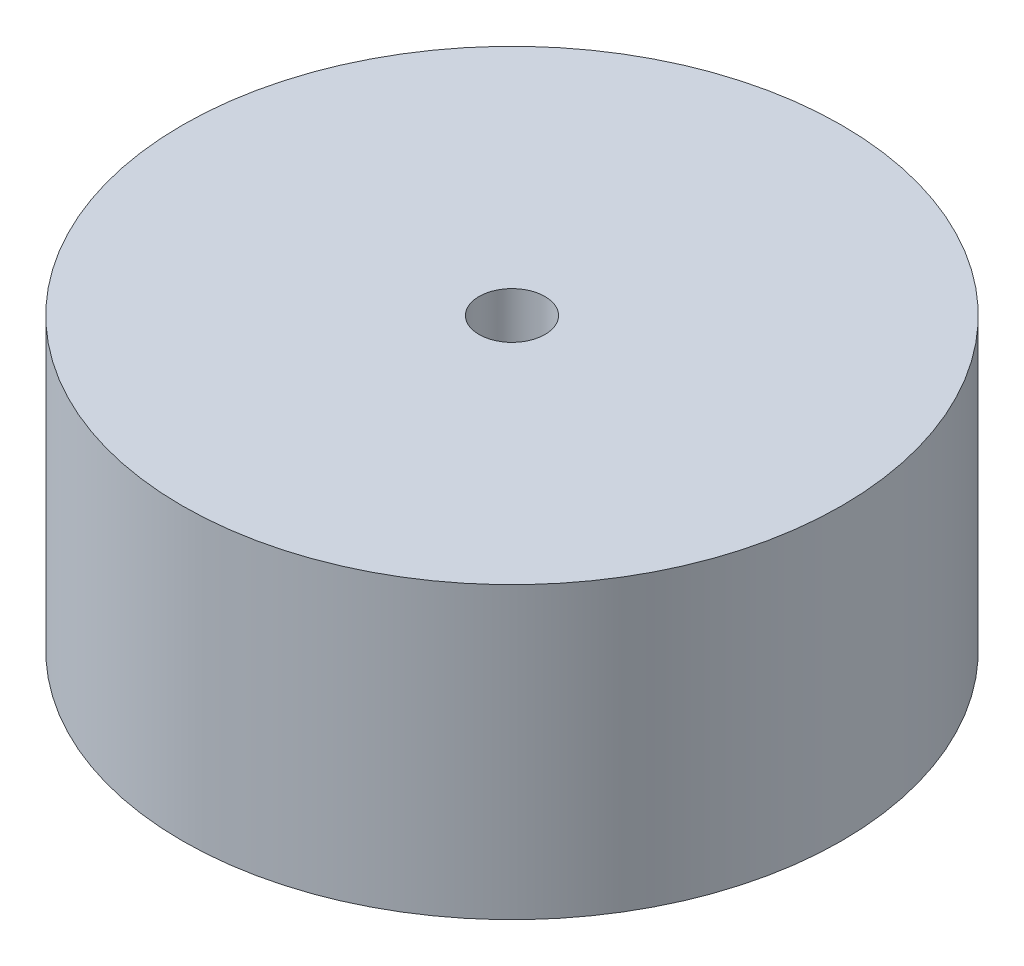
ISO-10303-21;
HEADER;
FILE_DESCRIPTION(('STEP AP214'),'2;1');
FILE_NAME('part.step','',(''),(''),'','','');
FILE_SCHEMA(('AUTOMOTIVE_DESIGN { 1 0 10303 214 1 1 1 1 }'));
ENDSEC;
DATA;
#1=APPLICATION_CONTEXT('core data for automotive mechanical design processes');
#2=APPLICATION_PROTOCOL_DEFINITION('international standard','automotive_design',2000,#1);
#3=PRODUCT_CONTEXT('',#1,'mechanical');
#4=PRODUCT('Part','Part','',(#3));
#5=PRODUCT_RELATED_PRODUCT_CATEGORY('part','',(#4));
#6=PRODUCT_DEFINITION_FORMATION('','',#4);
#7=PRODUCT_DEFINITION_CONTEXT('part definition',#1,'design');
#8=PRODUCT_DEFINITION('design','',#6,#7);
#9=PRODUCT_DEFINITION_SHAPE('','',#8);
#10=(LENGTH_UNIT() NAMED_UNIT(*) SI_UNIT(.MILLI.,.METRE.));
#11=(NAMED_UNIT(*) PLANE_ANGLE_UNIT() SI_UNIT($,.RADIAN.));
#12=(NAMED_UNIT(*) SI_UNIT($,.STERADIAN.) SOLID_ANGLE_UNIT());
#13=UNCERTAINTY_MEASURE_WITH_UNIT(LENGTH_MEASURE(1.E-05),#10,'distance_accuracy_value','');
#14=(GEOMETRIC_REPRESENTATION_CONTEXT(3) GLOBAL_UNCERTAINTY_ASSIGNED_CONTEXT((#13)) GLOBAL_UNIT_ASSIGNED_CONTEXT((#10,
#11,#12)) REPRESENTATION_CONTEXT('',''));
#15=CARTESIAN_POINT('',(0.,0.,0.));
#16=DIRECTION('',(0.,0.,1.));
#17=DIRECTION('',(1.,0.,0.));
#18=AXIS2_PLACEMENT_3D('',#15,#16,#17);
#19=CARTESIAN_POINT('',(0.,35.,0.));
#20=DIRECTION('',(0.,-1.,0.));
#21=DIRECTION('',(0.,0.,-1.));
#22=AXIS2_PLACEMENT_3D('',#19,#20,#21);
#23=CYLINDRICAL_SURFACE('',#22,30.);
#24=CARTESIAN_POINT('',(0.,8.,0.));
#25=DIRECTION('',(0.,1.,0.));
#26=DIRECTION('',(0.,0.,1.));
#27=AXIS2_PLACEMENT_3D('',#24,#25,#26);
#28=CIRCLE('',#27,30.);
#29=CARTESIAN_POINT('',(0.,8.,-30.));
#30=VERTEX_POINT('',#29);
#31=EDGE_CURVE('E10',#30,#30,#28,.T.);
#32=CARTESIAN_POINT('',(0.,34.4,0.));
#33=DIRECTION('',(0.,1.,0.));
#34=DIRECTION('',(0.,0.,1.));
#35=AXIS2_PLACEMENT_3D('',#32,#33,#34);
#36=CIRCLE('',#35,30.);
#37=CARTESIAN_POINT('',(0.,34.4,-30.));
#38=VERTEX_POINT('',#37);
#39=EDGE_CURVE('E47',#38,#38,#36,.T.);
#40=CARTESIAN_POINT('',(0.,8.,-30.));
#41=CARTESIAN_POINT('',(0.,8.275,-30.));
#42=CARTESIAN_POINT('',(0.,8.55,-30.));
#43=CARTESIAN_POINT('',(0.,9.1,-30.));
#44=CARTESIAN_POINT('',(0.,9.375,-30.));
#45=CARTESIAN_POINT('',(0.,9.925,-30.));
#46=CARTESIAN_POINT('',(0.,10.2,-30.));
#47=CARTESIAN_POINT('',(0.,10.75,-30.));
#48=CARTESIAN_POINT('',(0.,11.025,-30.));
#49=CARTESIAN_POINT('',(0.,11.575,-30.));
#50=CARTESIAN_POINT('',(0.,11.85,-30.));
#51=CARTESIAN_POINT('',(0.,12.4,-30.));
#52=CARTESIAN_POINT('',(0.,12.675,-30.));
#53=CARTESIAN_POINT('',(0.,13.225,-30.));
#54=CARTESIAN_POINT('',(0.,13.5,-30.));
#55=CARTESIAN_POINT('',(0.,14.05,-30.));
#56=CARTESIAN_POINT('',(0.,14.325,-30.));
#57=CARTESIAN_POINT('',(0.,14.875,-30.));
#58=CARTESIAN_POINT('',(0.,15.15,-30.));
#59=CARTESIAN_POINT('',(0.,15.7,-30.));
#60=CARTESIAN_POINT('',(0.,15.975,-30.));
#61=CARTESIAN_POINT('',(0.,16.525,-30.));
#62=CARTESIAN_POINT('',(0.,16.8,-30.));
#63=CARTESIAN_POINT('',(0.,17.35,-30.));
#64=CARTESIAN_POINT('',(0.,17.625,-30.));
#65=CARTESIAN_POINT('',(0.,18.175,-30.));
#66=CARTESIAN_POINT('',(0.,18.45,-30.));
#67=CARTESIAN_POINT('',(0.,19.,-30.));
#68=CARTESIAN_POINT('',(0.,19.275,-30.));
#69=CARTESIAN_POINT('',(0.,19.825,-30.));
#70=CARTESIAN_POINT('',(0.,20.1,-30.));
#71=CARTESIAN_POINT('',(0.,20.65,-30.));
#72=CARTESIAN_POINT('',(0.,20.925,-30.));
#73=CARTESIAN_POINT('',(0.,21.475,-30.));
#74=CARTESIAN_POINT('',(0.,21.75,-30.));
#75=CARTESIAN_POINT('',(0.,22.3,-30.));
#76=CARTESIAN_POINT('',(0.,22.575,-30.));
#77=CARTESIAN_POINT('',(0.,23.125,-30.));
#78=CARTESIAN_POINT('',(0.,23.4,-30.));
#79=CARTESIAN_POINT('',(0.,23.95,-30.));
#80=CARTESIAN_POINT('',(0.,24.225,-30.));
#81=CARTESIAN_POINT('',(0.,24.775,-30.));
#82=CARTESIAN_POINT('',(0.,25.05,-30.));
#83=CARTESIAN_POINT('',(0.,25.6,-30.));
#84=CARTESIAN_POINT('',(0.,25.875,-30.));
#85=CARTESIAN_POINT('',(0.,26.425,-30.));
#86=CARTESIAN_POINT('',(0.,26.7,-30.));
#87=CARTESIAN_POINT('',(0.,27.25,-30.));
#88=CARTESIAN_POINT('',(0.,27.525,-30.));
#89=CARTESIAN_POINT('',(0.,28.075,-30.));
#90=CARTESIAN_POINT('',(0.,28.35,-30.));
#91=CARTESIAN_POINT('',(0.,28.9,-30.));
#92=CARTESIAN_POINT('',(0.,29.175,-30.));
#93=CARTESIAN_POINT('',(0.,29.725,-30.));
#94=CARTESIAN_POINT('',(0.,30.,-30.));
#95=CARTESIAN_POINT('',(0.,30.55,-30.));
#96=CARTESIAN_POINT('',(0.,30.825,-30.));
#97=CARTESIAN_POINT('',(0.,31.375,-30.));
#98=CARTESIAN_POINT('',(0.,31.65,-30.));
#99=CARTESIAN_POINT('',(0.,32.2,-30.));
#100=CARTESIAN_POINT('',(0.,32.475,-30.));
#101=CARTESIAN_POINT('',(0.,33.025,-30.));
#102=CARTESIAN_POINT('',(0.,33.3,-30.));
#103=CARTESIAN_POINT('',(0.,33.85,-30.));
#104=CARTESIAN_POINT('',(0.,34.125,-30.));
#105=CARTESIAN_POINT('',(0.,34.4,-30.));
#106=B_SPLINE_CURVE_WITH_KNOTS('',3,(#40,#41,#42,#43,#44,#45,#46,#47,#48,#49,#50,#51,#52,#53,
#54,#55,#56,#57,#58,#59,#60,#61,#62,#63,#64,#65,#66,#67,#68,#69,#70,#71,#72,#73,#74,#75,#76,#77,
#78,#79,#80,#81,#82,#83,#84,#85,#86,#87,#88,#89,#90,#91,#92,#93,#94,#95,#96,#97,#98,#99,#100,
#101,#102,#103,#104,#105),.UNSPECIFIED.,.F.,.F.,(4,2,2,2,2,2,2,2,2,2,2,2,2,2,2,2,2,2,2,2,2,2,2,
2,2,2,2,2,2,2,2,2,4),(0.,0.824999999999999,1.65,2.475,3.3,4.125,4.95,5.775,6.6,7.425,8.25,9.075,
9.9,10.725,11.55,12.375,13.2,14.025,14.85,15.675,16.5,17.325,18.15,18.975,19.8,20.625,21.45,
22.275,23.1,23.925,24.75,25.575,26.4),.UNSPECIFIED.);
#107=EDGE_CURVE('BSEAM37',#30,#38,#106,.T.);
#108=ORIENTED_EDGE('',*,*,#31,.T.);
#109=ORIENTED_EDGE('',*,*,#39,.F.);
#110=ORIENTED_EDGE('',*,*,#107,.T.);
#111=ORIENTED_EDGE('',*,*,#107,.F.);
#112=EDGE_LOOP('',(#108,#110,#109,#111));
#113=FACE_BOUND('',#112,.T.);
#114=ADVANCED_FACE('F37',(#113),#23,.T.);
#115=CARTESIAN_POINT('',(0.,35.,0.));
#116=DIRECTION('',(0.,-1.,0.));
#117=DIRECTION('',(0.,0.,-1.));
#118=AXIS2_PLACEMENT_3D('',#115,#116,#117);
#119=CYLINDRICAL_SURFACE('',#118,3.);
#120=CARTESIAN_POINT('',(0.,8.,0.));
#121=DIRECTION('',(0.,-1.,0.));
#122=DIRECTION('',(0.,0.,-1.));
#123=AXIS2_PLACEMENT_3D('',#120,#121,#122);
#124=CIRCLE('',#123,3.);
#125=CARTESIAN_POINT('',(0.,8.,-3.));
#126=VERTEX_POINT('',#125);
#127=EDGE_CURVE('E43',#126,#126,#124,.T.);
#128=CARTESIAN_POINT('',(0.,34.4,0.));
#129=DIRECTION('',(0.,1.,0.));
#130=DIRECTION('',(0.,0.,1.));
#131=AXIS2_PLACEMENT_3D('',#128,#129,#130);
#132=CIRCLE('',#131,3.);
#133=CARTESIAN_POINT('',(0.,34.4,-3.));
#134=VERTEX_POINT('',#133);
#135=EDGE_CURVE('E51',#134,#134,#132,.T.);
#136=CARTESIAN_POINT('',(0.,8.,-3.));
#137=CARTESIAN_POINT('',(0.,8.275,-3.));
#138=CARTESIAN_POINT('',(0.,8.55,-3.));
#139=CARTESIAN_POINT('',(0.,9.1,-3.));
#140=CARTESIAN_POINT('',(0.,9.375,-3.));
#141=CARTESIAN_POINT('',(0.,9.925,-3.));
#142=CARTESIAN_POINT('',(0.,10.2,-3.));
#143=CARTESIAN_POINT('',(0.,10.75,-3.));
#144=CARTESIAN_POINT('',(0.,11.025,-3.));
#145=CARTESIAN_POINT('',(0.,11.575,-3.));
#146=CARTESIAN_POINT('',(0.,11.85,-3.));
#147=CARTESIAN_POINT('',(0.,12.4,-3.));
#148=CARTESIAN_POINT('',(0.,12.675,-3.));
#149=CARTESIAN_POINT('',(0.,13.225,-3.));
#150=CARTESIAN_POINT('',(0.,13.5,-3.));
#151=CARTESIAN_POINT('',(0.,14.05,-3.));
#152=CARTESIAN_POINT('',(0.,14.325,-3.));
#153=CARTESIAN_POINT('',(0.,14.875,-3.));
#154=CARTESIAN_POINT('',(0.,15.15,-3.));
#155=CARTESIAN_POINT('',(0.,15.7,-3.));
#156=CARTESIAN_POINT('',(0.,15.975,-3.));
#157=CARTESIAN_POINT('',(0.,16.525,-3.));
#158=CARTESIAN_POINT('',(0.,16.8,-3.));
#159=CARTESIAN_POINT('',(0.,17.35,-3.));
#160=CARTESIAN_POINT('',(0.,17.625,-3.));
#161=CARTESIAN_POINT('',(0.,18.175,-3.));
#162=CARTESIAN_POINT('',(0.,18.45,-3.));
#163=CARTESIAN_POINT('',(0.,19.,-3.));
#164=CARTESIAN_POINT('',(0.,19.275,-3.));
#165=CARTESIAN_POINT('',(0.,19.825,-3.));
#166=CARTESIAN_POINT('',(0.,20.1,-3.));
#167=CARTESIAN_POINT('',(0.,20.65,-3.));
#168=CARTESIAN_POINT('',(0.,20.925,-3.));
#169=CARTESIAN_POINT('',(0.,21.475,-3.));
#170=CARTESIAN_POINT('',(0.,21.75,-3.));
#171=CARTESIAN_POINT('',(0.,22.3,-3.));
#172=CARTESIAN_POINT('',(0.,22.575,-3.));
#173=CARTESIAN_POINT('',(0.,23.125,-3.));
#174=CARTESIAN_POINT('',(0.,23.4,-3.));
#175=CARTESIAN_POINT('',(0.,23.95,-3.));
#176=CARTESIAN_POINT('',(0.,24.225,-3.));
#177=CARTESIAN_POINT('',(0.,24.775,-3.));
#178=CARTESIAN_POINT('',(0.,25.05,-3.));
#179=CARTESIAN_POINT('',(0.,25.6,-3.));
#180=CARTESIAN_POINT('',(0.,25.875,-3.));
#181=CARTESIAN_POINT('',(0.,26.425,-3.));
#182=CARTESIAN_POINT('',(0.,26.7,-3.));
#183=CARTESIAN_POINT('',(0.,27.25,-3.));
#184=CARTESIAN_POINT('',(0.,27.525,-3.));
#185=CARTESIAN_POINT('',(0.,28.075,-3.));
#186=CARTESIAN_POINT('',(0.,28.35,-3.));
#187=CARTESIAN_POINT('',(0.,28.9,-3.));
#188=CARTESIAN_POINT('',(0.,29.175,-3.));
#189=CARTESIAN_POINT('',(0.,29.725,-3.));
#190=CARTESIAN_POINT('',(0.,30.,-3.));
#191=CARTESIAN_POINT('',(0.,30.55,-3.));
#192=CARTESIAN_POINT('',(0.,30.825,-3.));
#193=CARTESIAN_POINT('',(0.,31.375,-3.));
#194=CARTESIAN_POINT('',(0.,31.65,-3.));
#195=CARTESIAN_POINT('',(0.,32.2,-3.));
#196=CARTESIAN_POINT('',(0.,32.475,-3.));
#197=CARTESIAN_POINT('',(0.,33.025,-3.));
#198=CARTESIAN_POINT('',(0.,33.3,-3.));
#199=CARTESIAN_POINT('',(0.,33.85,-3.));
#200=CARTESIAN_POINT('',(0.,34.125,-3.));
#201=CARTESIAN_POINT('',(0.,34.4,-3.));
#202=B_SPLINE_CURVE_WITH_KNOTS('',3,(#136,#137,#138,#139,#140,#141,#142,#143,#144,#145,#146,
#147,#148,#149,#150,#151,#152,#153,#154,#155,#156,#157,#158,#159,#160,#161,#162,#163,#164,#165,
#166,#167,#168,#169,#170,#171,#172,#173,#174,#175,#176,#177,#178,#179,#180,#181,#182,#183,#184,
#185,#186,#187,#188,#189,#190,#191,#192,#193,#194,#195,#196,#197,#198,#199,#200,#201),
.UNSPECIFIED.,.F.,.F.,(4,2,2,2,2,2,2,2,2,2,2,2,2,2,2,2,2,2,2,2,2,2,2,2,2,2,2,2,2,2,2,2,4),(0.,
0.824999999999999,1.65,2.475,3.3,4.125,4.95,5.775,6.6,7.425,8.25,9.075,9.9,10.725,11.55,12.375,
13.2,14.025,14.85,15.675,16.5,17.325,18.15,18.975,19.8,20.625,21.45,22.275,23.1,23.925,24.75,
25.575,26.4),.UNSPECIFIED.);
#203=EDGE_CURVE('BSEAM57',#126,#134,#202,.T.);
#204=ORIENTED_EDGE('',*,*,#127,.T.);
#205=ORIENTED_EDGE('',*,*,#135,.T.);
#206=ORIENTED_EDGE('',*,*,#203,.T.);
#207=ORIENTED_EDGE('',*,*,#203,.F.);
#208=EDGE_LOOP('',(#204,#206,#205,#207));
#209=FACE_BOUND('',#208,.T.);
#210=ADVANCED_FACE('F57',(#209),#119,.F.);
#211=CARTESIAN_POINT('',(0.,8.,0.));
#212=DIRECTION('',(0.,1.,0.));
#213=DIRECTION('',(0.,0.,1.));
#214=AXIS2_PLACEMENT_3D('',#211,#212,#213);
#215=PLANE('',#214);
#216=ORIENTED_EDGE('',*,*,#127,.F.);
#217=EDGE_LOOP('',(#216));
#218=FACE_BOUND('',#217,.T.);
#219=ORIENTED_EDGE('',*,*,#31,.F.);
#220=EDGE_LOOP('',(#219));
#221=FACE_BOUND('',#220,.T.);
#222=ADVANCED_FACE('F61',(#218,#221),#215,.F.);
#223=CARTESIAN_POINT('',(0.,34.4,0.));
#224=DIRECTION('',(0.,1.,0.));
#225=DIRECTION('',(0.,0.,1.));
#226=AXIS2_PLACEMENT_3D('',#223,#224,#225);
#227=PLANE('',#226);
#228=ORIENTED_EDGE('',*,*,#39,.T.);
#229=EDGE_LOOP('',(#228));
#230=FACE_BOUND('',#229,.T.);
#231=ORIENTED_EDGE('',*,*,#135,.F.);
#232=EDGE_LOOP('',(#231));
#233=FACE_BOUND('',#232,.T.);
#234=ADVANCED_FACE('F59',(#230,#233),#227,.T.);
#235=CLOSED_SHELL('',(#114,#210,#222,#234));
#236=MANIFOLD_SOLID_BREP('B2',#235);
#237=ADVANCED_BREP_SHAPE_REPRESENTATION('',(#18,#236),#14);
#238=SHAPE_DEFINITION_REPRESENTATION(#9,#237);
ENDSEC;
END-ISO-10303-21;
